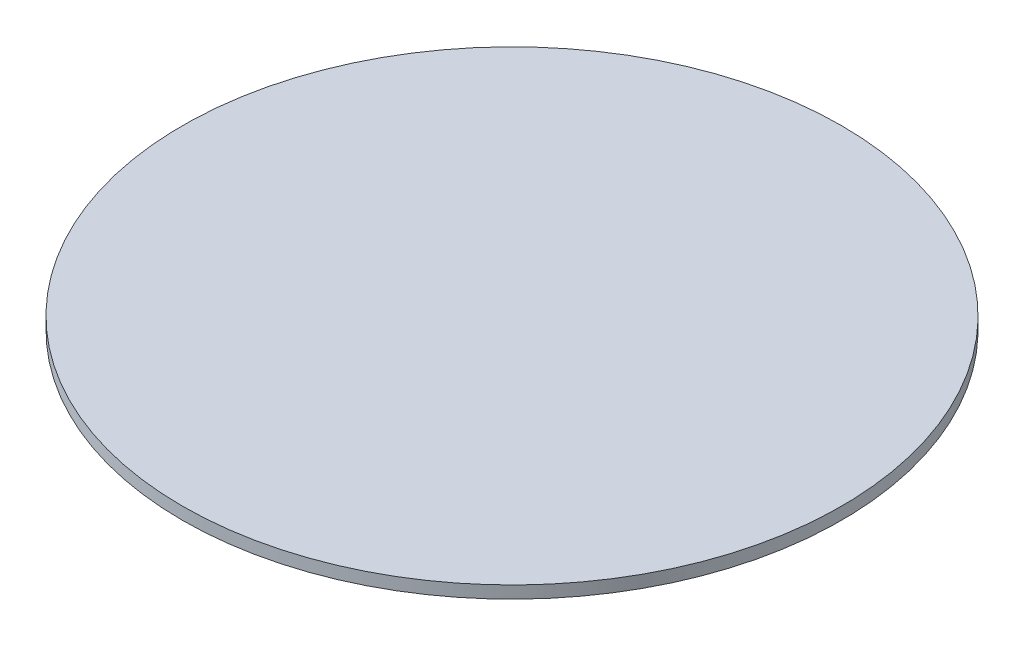
ISO-10303-21;
HEADER;
FILE_DESCRIPTION(('STEP AP214'),'2;1');
FILE_NAME('part.step','',(''),(''),'','','');
FILE_SCHEMA(('AUTOMOTIVE_DESIGN { 1 0 10303 214 1 1 1 1 }'));
ENDSEC;
DATA;
#1=APPLICATION_CONTEXT('core data for automotive mechanical design processes');
#2=APPLICATION_PROTOCOL_DEFINITION('international standard','automotive_design',2000,#1);
#3=PRODUCT_CONTEXT('',#1,'mechanical');
#4=PRODUCT('Part','Part','',(#3));
#5=PRODUCT_RELATED_PRODUCT_CATEGORY('part','',(#4));
#6=PRODUCT_DEFINITION_FORMATION('','',#4);
#7=PRODUCT_DEFINITION_CONTEXT('part definition',#1,'design');
#8=PRODUCT_DEFINITION('design','',#6,#7);
#9=PRODUCT_DEFINITION_SHAPE('','',#8);
#10=(LENGTH_UNIT() NAMED_UNIT(*) SI_UNIT(.MILLI.,.METRE.));
#11=(NAMED_UNIT(*) PLANE_ANGLE_UNIT() SI_UNIT($,.RADIAN.));
#12=(NAMED_UNIT(*) SI_UNIT($,.STERADIAN.) SOLID_ANGLE_UNIT());
#13=UNCERTAINTY_MEASURE_WITH_UNIT(LENGTH_MEASURE(1.E-05),#10,'distance_accuracy_value','');
#14=(GEOMETRIC_REPRESENTATION_CONTEXT(3) GLOBAL_UNCERTAINTY_ASSIGNED_CONTEXT((#13)) GLOBAL_UNIT_ASSIGNED_CONTEXT((#10,
#11,#12)) REPRESENTATION_CONTEXT('',''));
#15=CARTESIAN_POINT('',(0.,0.,0.));
#16=DIRECTION('',(0.,0.,1.));
#17=DIRECTION('',(1.,0.,0.));
#18=AXIS2_PLACEMENT_3D('',#15,#16,#17);
#19=CARTESIAN_POINT('',(0.,158.120727786492,0.));
#20=DIRECTION('',(0.,1.,0.));
#21=DIRECTION('',(0.,0.,1.));
#22=AXIS2_PLACEMENT_3D('',#19,#20,#21);
#23=PLANE('',#22);
#24=CARTESIAN_POINT('',(0.,158.120727786492,0.));
#25=DIRECTION('',(0.,-1.,0.));
#26=DIRECTION('',(0.,0.,-1.));
#27=AXIS2_PLACEMENT_3D('',#24,#25,#26);
#28=CIRCLE('',#27,80.3108699335247);
#29=CARTESIAN_POINT('',(0.,158.120727786492,-80.3108699335247));
#30=VERTEX_POINT('',#29);
#31=EDGE_CURVE('E10',#30,#30,#28,.T.);
#32=ORIENTED_EDGE('',*,*,#31,.T.);
#33=EDGE_LOOP('',(#32));
#34=FACE_BOUND('',#33,.T.);
#35=ADVANCED_FACE('F33',(#34),#23,.F.);
#36=CARTESIAN_POINT('',(0.,0.,0.));
#37=DIRECTION('',(0.,-1.,0.));
#38=DIRECTION('',(0.,0.,-1.));
#39=AXIS2_PLACEMENT_3D('',#36,#37,#38);
#40=CYLINDRICAL_SURFACE('',#39,80.3108699335247);
#41=ORIENTED_EDGE('',*,*,#31,.F.);
#42=EDGE_LOOP('',(#41));
#43=FACE_BOUND('',#42,.T.);
#44=CARTESIAN_POINT('',(0.,161.120727786492,0.));
#45=DIRECTION('',(0.,-1.,0.));
#46=DIRECTION('',(0.,0.,-1.));
#47=AXIS2_PLACEMENT_3D('',#44,#45,#46);
#48=CIRCLE('',#47,80.3108699335247);
#49=CARTESIAN_POINT('',(0.,161.120727786492,-80.3108699335247));
#50=VERTEX_POINT('',#49);
#51=EDGE_CURVE('E39',#50,#50,#48,.T.);
#52=ORIENTED_EDGE('',*,*,#51,.T.);
#53=EDGE_LOOP('',(#52));
#54=FACE_BOUND('',#53,.T.);
#55=ADVANCED_FACE('F45',(#43,#54),#40,.T.);
#56=CARTESIAN_POINT('',(0.,161.120727786492,0.));
#57=DIRECTION('',(0.,-1.,0.));
#58=DIRECTION('',(0.,0.,-1.));
#59=AXIS2_PLACEMENT_3D('',#56,#57,#58);
#60=PLANE('',#59);
#61=ORIENTED_EDGE('',*,*,#51,.F.);
#62=EDGE_LOOP('',(#61));
#63=FACE_BOUND('',#62,.T.);
#64=ADVANCED_FACE('F47',(#63),#60,.F.);
#65=CLOSED_SHELL('',(#35,#55,#64));
#66=MANIFOLD_SOLID_BREP('B2',#65);
#67=ADVANCED_BREP_SHAPE_REPRESENTATION('',(#18,#66),#14);
#68=SHAPE_DEFINITION_REPRESENTATION(#9,#67);
ENDSEC;
END-ISO-10303-21;
